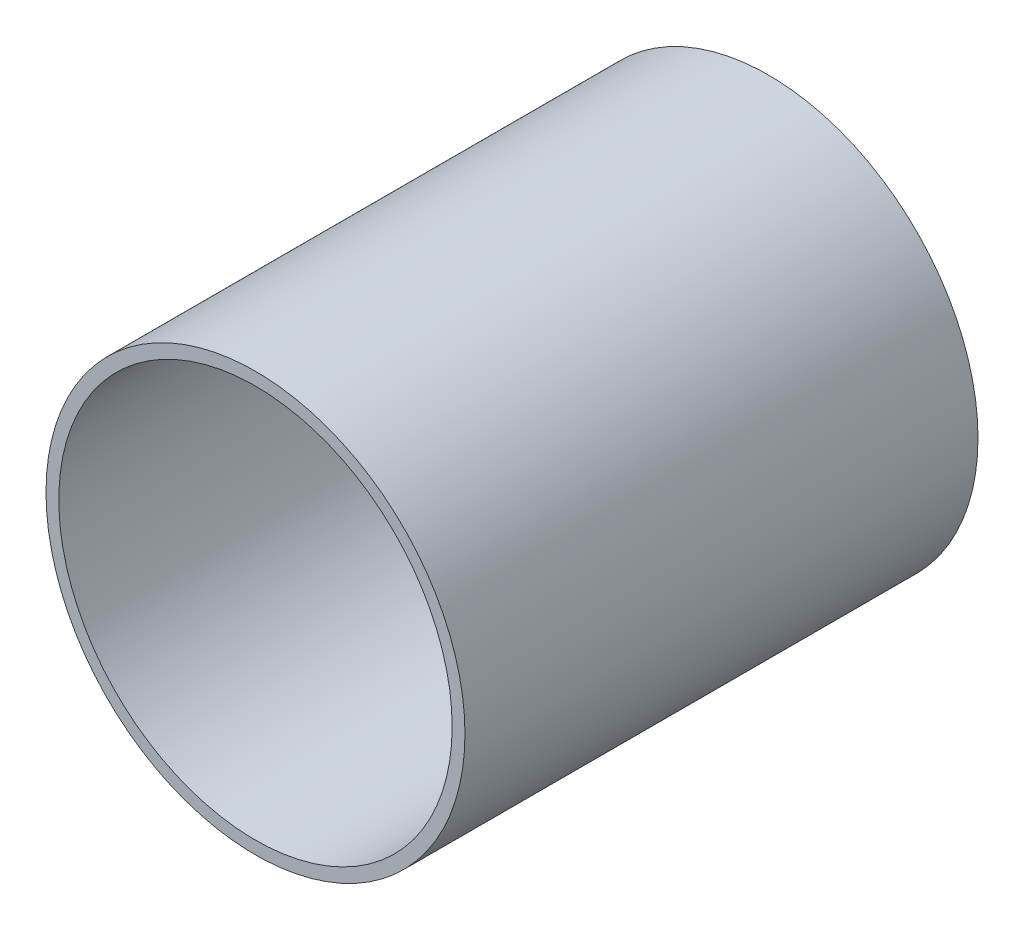
ISO-10303-21;
HEADER;
FILE_DESCRIPTION(('STEP AP214'),'2;1');
FILE_NAME('part.step','',(''),(''),'','','');
FILE_SCHEMA(('AUTOMOTIVE_DESIGN { 1 0 10303 214 1 1 1 1 }'));
ENDSEC;
DATA;
#1=APPLICATION_CONTEXT('core data for automotive mechanical design processes');
#2=APPLICATION_PROTOCOL_DEFINITION('international standard','automotive_design',2000,#1);
#3=PRODUCT_CONTEXT('',#1,'mechanical');
#4=PRODUCT('Part','Part','',(#3));
#5=PRODUCT_RELATED_PRODUCT_CATEGORY('part','',(#4));
#6=PRODUCT_DEFINITION_FORMATION('','',#4);
#7=PRODUCT_DEFINITION_CONTEXT('part definition',#1,'design');
#8=PRODUCT_DEFINITION('design','',#6,#7);
#9=PRODUCT_DEFINITION_SHAPE('','',#8);
#10=(LENGTH_UNIT() NAMED_UNIT(*) SI_UNIT(.MILLI.,.METRE.));
#11=(NAMED_UNIT(*) PLANE_ANGLE_UNIT() SI_UNIT($,.RADIAN.));
#12=(NAMED_UNIT(*) SI_UNIT($,.STERADIAN.) SOLID_ANGLE_UNIT());
#13=UNCERTAINTY_MEASURE_WITH_UNIT(LENGTH_MEASURE(1.E-05),#10,'distance_accuracy_value','');
#14=(GEOMETRIC_REPRESENTATION_CONTEXT(3) GLOBAL_UNCERTAINTY_ASSIGNED_CONTEXT((#13)) GLOBAL_UNIT_ASSIGNED_CONTEXT((#10,
#11,#12)) REPRESENTATION_CONTEXT('',''));
#15=CARTESIAN_POINT('',(0.,0.,0.));
#16=DIRECTION('',(0.,0.,1.));
#17=DIRECTION('',(1.,0.,0.));
#18=AXIS2_PLACEMENT_3D('',#15,#16,#17);
#19=CARTESIAN_POINT('',(0.,0.,6.));
#20=DIRECTION('',(0.,0.,-1.));
#21=DIRECTION('',(-1.,0.,0.));
#22=AXIS2_PLACEMENT_3D('',#19,#20,#21);
#23=CYLINDRICAL_SURFACE('',#22,2.45);
#24=CARTESIAN_POINT('',(0.,0.,6.));
#25=DIRECTION('',(0.,0.,1.));
#26=DIRECTION('',(1.,0.,0.));
#27=AXIS2_PLACEMENT_3D('',#24,#25,#26);
#28=CIRCLE('',#27,2.45);
#29=CARTESIAN_POINT('',(2.45,0.,6.));
#30=VERTEX_POINT('',#29);
#31=EDGE_CURVE('E10',#30,#30,#28,.T.);
#32=ORIENTED_EDGE('',*,*,#31,.F.);
#33=EDGE_LOOP('',(#32));
#34=FACE_BOUND('',#33,.T.);
#35=CARTESIAN_POINT('',(0.,0.,0.));
#36=DIRECTION('',(0.,0.,1.));
#37=DIRECTION('',(1.,0.,0.));
#38=AXIS2_PLACEMENT_3D('',#35,#36,#37);
#39=CIRCLE('',#38,2.45);
#40=CARTESIAN_POINT('',(2.45,0.,0.));
#41=VERTEX_POINT('',#40);
#42=EDGE_CURVE('E37',#41,#41,#39,.T.);
#43=ORIENTED_EDGE('',*,*,#42,.T.);
#44=EDGE_LOOP('',(#43));
#45=FACE_BOUND('',#44,.T.);
#46=ADVANCED_FACE('F34',(#34,#45),#23,.T.);
#47=CARTESIAN_POINT('',(0.,0.,6.));
#48=DIRECTION('',(0.,0.,1.));
#49=DIRECTION('',(1.,0.,0.));
#50=AXIS2_PLACEMENT_3D('',#47,#48,#49);
#51=PLANE('',#50);
#52=CARTESIAN_POINT('',(0.,0.,6.));
#53=DIRECTION('',(0.,0.,1.));
#54=DIRECTION('',(1.,0.,0.));
#55=AXIS2_PLACEMENT_3D('',#52,#53,#54);
#56=CIRCLE('',#55,2.3);
#57=CARTESIAN_POINT('',(2.3,0.,6.));
#58=VERTEX_POINT('',#57);
#59=EDGE_CURVE('E46',#58,#58,#56,.T.);
#60=ORIENTED_EDGE('',*,*,#59,.F.);
#61=EDGE_LOOP('',(#60));
#62=FACE_BOUND('',#61,.T.);
#63=ORIENTED_EDGE('',*,*,#31,.T.);
#64=EDGE_LOOP('',(#63));
#65=FACE_BOUND('',#64,.T.);
#66=ADVANCED_FACE('F61',(#62,#65),#51,.T.);
#67=CARTESIAN_POINT('',(0.,0.,0.));
#68=DIRECTION('',(0.,0.,1.));
#69=DIRECTION('',(1.,0.,0.));
#70=AXIS2_PLACEMENT_3D('',#67,#68,#69);
#71=PLANE('',#70);
#72=ORIENTED_EDGE('',*,*,#42,.F.);
#73=EDGE_LOOP('',(#72));
#74=FACE_BOUND('',#73,.T.);
#75=ADVANCED_FACE('F57',(#74),#71,.F.);
#76=CARTESIAN_POINT('',(0.,0.,0.25));
#77=DIRECTION('',(0.,0.,1.));
#78=DIRECTION('',(1.,0.,0.));
#79=AXIS2_PLACEMENT_3D('',#76,#77,#78);
#80=CYLINDRICAL_SURFACE('',#79,2.3);
#81=CARTESIAN_POINT('',(0.,0.,0.25));
#82=DIRECTION('',(0.,0.,1.));
#83=DIRECTION('',(1.,0.,0.));
#84=AXIS2_PLACEMENT_3D('',#81,#82,#83);
#85=CIRCLE('',#84,2.3);
#86=CARTESIAN_POINT('',(2.3,0.,0.25));
#87=VERTEX_POINT('',#86);
#88=EDGE_CURVE('E44',#87,#87,#85,.T.);
#89=ORIENTED_EDGE('',*,*,#88,.F.);
#90=EDGE_LOOP('',(#89));
#91=FACE_BOUND('',#90,.T.);
#92=ORIENTED_EDGE('',*,*,#59,.T.);
#93=EDGE_LOOP('',(#92));
#94=FACE_BOUND('',#93,.T.);
#95=ADVANCED_FACE('F54',(#91,#94),#80,.F.);
#96=CARTESIAN_POINT('',(0.,0.,0.25));
#97=DIRECTION('',(0.,0.,1.));
#98=DIRECTION('',(1.,0.,0.));
#99=AXIS2_PLACEMENT_3D('',#96,#97,#98);
#100=PLANE('',#99);
#101=ORIENTED_EDGE('',*,*,#88,.T.);
#102=EDGE_LOOP('',(#101));
#103=FACE_BOUND('',#102,.T.);
#104=ADVANCED_FACE('F52',(#103),#100,.T.);
#105=CLOSED_SHELL('',(#46,#66,#75,#95,#104));
#106=MANIFOLD_SOLID_BREP('B2',#105);
#107=ADVANCED_BREP_SHAPE_REPRESENTATION('',(#18,#106),#14);
#108=SHAPE_DEFINITION_REPRESENTATION(#9,#107);
ENDSEC;
END-ISO-10303-21;
